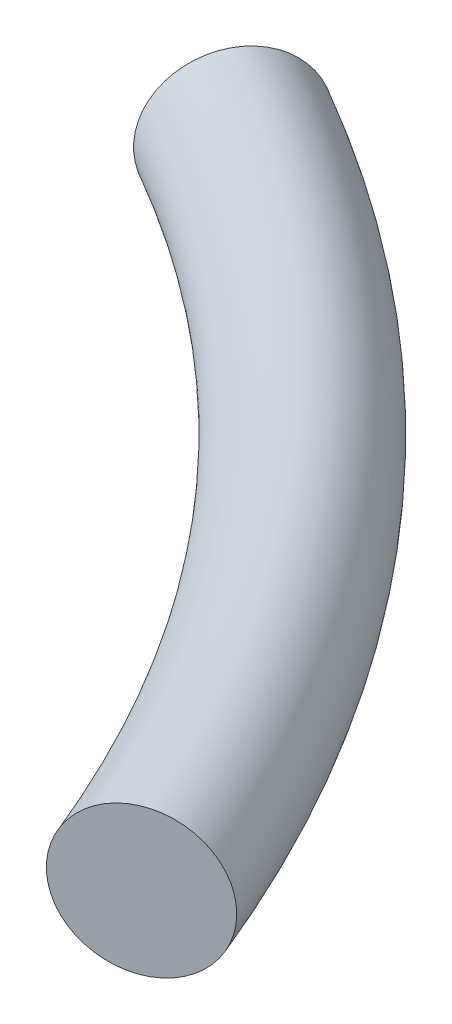
ISO-10303-21;
HEADER;
FILE_DESCRIPTION(('STEP AP214'),'2;1');
FILE_NAME('part.step','',(''),(''),'','','');
FILE_SCHEMA(('AUTOMOTIVE_DESIGN { 1 0 10303 214 1 1 1 1 }'));
ENDSEC;
DATA;
#1=APPLICATION_CONTEXT('core data for automotive mechanical design processes');
#2=APPLICATION_PROTOCOL_DEFINITION('international standard','automotive_design',2000,#1);
#3=PRODUCT_CONTEXT('',#1,'mechanical');
#4=PRODUCT('Part','Part','',(#3));
#5=PRODUCT_RELATED_PRODUCT_CATEGORY('part','',(#4));
#6=PRODUCT_DEFINITION_FORMATION('','',#4);
#7=PRODUCT_DEFINITION_CONTEXT('part definition',#1,'design');
#8=PRODUCT_DEFINITION('design','',#6,#7);
#9=PRODUCT_DEFINITION_SHAPE('','',#8);
#10=(LENGTH_UNIT() NAMED_UNIT(*) SI_UNIT(.MILLI.,.METRE.));
#11=(NAMED_UNIT(*) PLANE_ANGLE_UNIT() SI_UNIT($,.RADIAN.));
#12=(NAMED_UNIT(*) SI_UNIT($,.STERADIAN.) SOLID_ANGLE_UNIT());
#13=UNCERTAINTY_MEASURE_WITH_UNIT(LENGTH_MEASURE(1.E-05),#10,'distance_accuracy_value','');
#14=(GEOMETRIC_REPRESENTATION_CONTEXT(3) GLOBAL_UNCERTAINTY_ASSIGNED_CONTEXT((#13)) GLOBAL_UNIT_ASSIGNED_CONTEXT((#10,
#11,#12)) REPRESENTATION_CONTEXT('',''));
#15=CARTESIAN_POINT('',(0.,0.,0.));
#16=DIRECTION('',(0.,0.,1.));
#17=DIRECTION('',(1.,0.,0.));
#18=AXIS2_PLACEMENT_3D('',#15,#16,#17);
#19=CARTESIAN_POINT('',(0.,0.,0.));
#20=DIRECTION('',(-0.866025403784443,0.,-0.499999999999992));
#21=DIRECTION('',(-0.499999999999992,0.,0.866025403784443));
#22=AXIS2_PLACEMENT_3D('',#19,#20,#21);
#23=PLANE('',#22);
#24=CARTESIAN_POINT('',(3.91249999999994,4.2698,-6.77664878461327));
#25=DIRECTION('',(-0.866025403784443,0.,-0.499999999999992));
#26=DIRECTION('',(-0.499999999999992,0.,0.866025403784444));
#27=AXIS2_PLACEMENT_3D('',#24,#25,#26);
#28=CIRCLE('',#27,0.4);
#29=CARTESIAN_POINT('',(4.11249999999993,4.2698,-7.12305894612705));
#30=VERTEX_POINT('',#29);
#31=EDGE_CURVE('E12',#30,#30,#28,.T.);
#32=ORIENTED_EDGE('',*,*,#31,.T.);
#33=EDGE_LOOP('',(#32));
#34=FACE_BOUND('',#33,.T.);
#35=ADVANCED_FACE('F23',(#34),#23,.T.);
#36=CARTESIAN_POINT('',(0.,0.,0.));
#37=DIRECTION('',(-0.37460659341592,0.,-0.927183854566784));
#38=DIRECTION('',(-0.927183854566784,0.,0.37460659341592));
#39=AXIS2_PLACEMENT_3D('',#36,#37,#38);
#40=PLANE('',#39);
#41=CARTESIAN_POINT('',(7.25521366198509,4.2698,-2.93129659347957));
#42=DIRECTION('',(-0.37460659341592,0.,-0.927183854566785));
#43=DIRECTION('',(-0.927183854566785,0.,0.374606593415919));
#44=AXIS2_PLACEMENT_3D('',#41,#42,#43);
#45=CIRCLE('',#44,0.4);
#46=CARTESIAN_POINT('',(7.6260872038118,4.2698,-3.08113923084594));
#47=VERTEX_POINT('',#46);
#48=EDGE_CURVE('E30',#47,#47,#45,.T.);
#49=ORIENTED_EDGE('',*,*,#48,.F.);
#50=EDGE_LOOP('',(#49));
#51=FACE_BOUND('',#50,.T.);
#52=ADVANCED_FACE('F43',(#51),#40,.F.);
#53=CARTESIAN_POINT('',(0.,4.2698,0.));
#54=DIRECTION('',(0.,1.,0.));
#55=DIRECTION('',(-0.866025403784443,0.,-0.499999999999992));
#56=AXIS2_PLACEMENT_3D('',#53,#54,#55);
#57=TOROIDAL_SURFACE('',#56,7.825,0.4);
#58=CARTESIAN_POINT('',(0.,4.2698,0.));
#59=DIRECTION('',(0.,1.,0.));
#60=DIRECTION('',(-0.866025403784443,0.,-0.499999999999992));
#61=AXIS2_PLACEMENT_3D('',#58,#59,#60);
#62=CIRCLE('',#61,8.225);
#63=EDGE_CURVE('',#47,#30,#62,.T.);
#64=ORIENTED_EDGE('',*,*,#48,.T.);
#65=ORIENTED_EDGE('',*,*,#31,.F.);
#66=ORIENTED_EDGE('',*,*,#63,.T.);
#67=ORIENTED_EDGE('',*,*,#63,.F.);
#68=EDGE_LOOP('',(#64,#66,#65,#67));
#69=FACE_BOUND('',#68,.T.);
#70=ADVANCED_FACE('F41',(#69),#57,.T.);
#71=CLOSED_SHELL('',(#35,#52,#70));
#72=MANIFOLD_SOLID_BREP('B1',#71);
#73=ADVANCED_BREP_SHAPE_REPRESENTATION('',(#18,#72),#14);
#74=SHAPE_DEFINITION_REPRESENTATION(#9,#73);
ENDSEC;
END-ISO-10303-21;
